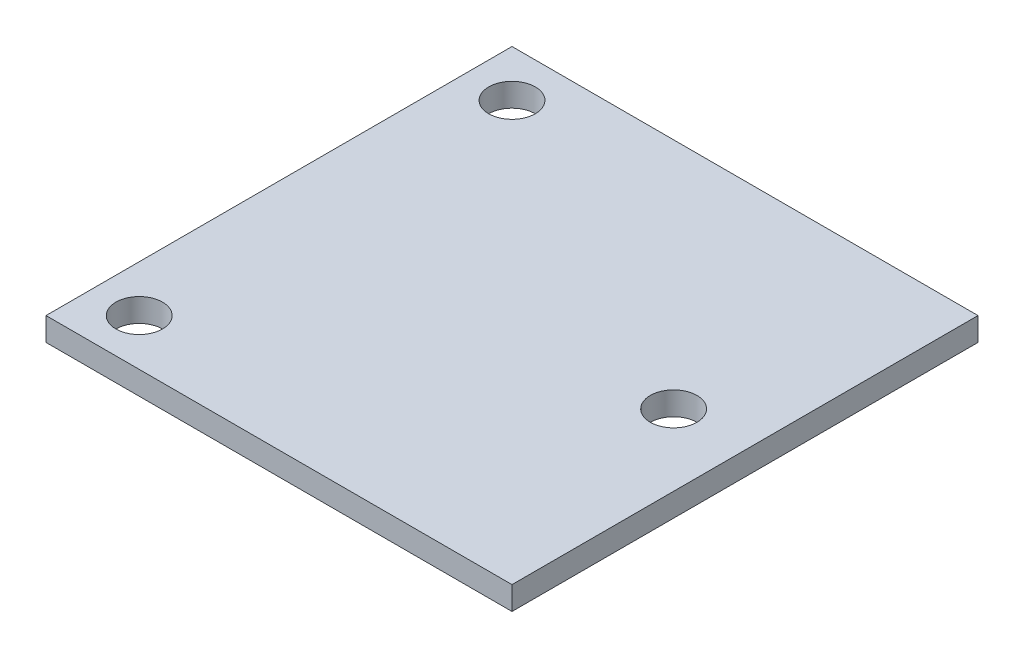
ISO-10303-21;
HEADER;
FILE_DESCRIPTION(('STEP AP214'),'2;1');
FILE_NAME('part.step','',(''),(''),'','','');
FILE_SCHEMA(('AUTOMOTIVE_DESIGN { 1 0 10303 214 1 1 1 1 }'));
ENDSEC;
DATA;
#1=APPLICATION_CONTEXT('core data for automotive mechanical design processes');
#2=APPLICATION_PROTOCOL_DEFINITION('international standard','automotive_design',2000,#1);
#3=PRODUCT_CONTEXT('',#1,'mechanical');
#4=PRODUCT('Part','Part','',(#3));
#5=PRODUCT_RELATED_PRODUCT_CATEGORY('part','',(#4));
#6=PRODUCT_DEFINITION_FORMATION('','',#4);
#7=PRODUCT_DEFINITION_CONTEXT('part definition',#1,'design');
#8=PRODUCT_DEFINITION('design','',#6,#7);
#9=PRODUCT_DEFINITION_SHAPE('','',#8);
#10=(LENGTH_UNIT() NAMED_UNIT(*) SI_UNIT(.MILLI.,.METRE.));
#11=(NAMED_UNIT(*) PLANE_ANGLE_UNIT() SI_UNIT($,.RADIAN.));
#12=(NAMED_UNIT(*) SI_UNIT($,.STERADIAN.) SOLID_ANGLE_UNIT());
#13=UNCERTAINTY_MEASURE_WITH_UNIT(LENGTH_MEASURE(1.E-05),#10,'distance_accuracy_value','');
#14=(GEOMETRIC_REPRESENTATION_CONTEXT(3) GLOBAL_UNCERTAINTY_ASSIGNED_CONTEXT((#13)) GLOBAL_UNIT_ASSIGNED_CONTEXT((#10,
#11,#12)) REPRESENTATION_CONTEXT('',''));
#15=CARTESIAN_POINT('',(0.,0.,0.));
#16=DIRECTION('',(0.,0.,1.));
#17=DIRECTION('',(1.,0.,0.));
#18=AXIS2_PLACEMENT_3D('',#15,#16,#17);
#19=CARTESIAN_POINT('',(0.,6.35,0.));
#20=DIRECTION('',(0.,-1.,0.));
#21=DIRECTION('',(0.,0.,-1.));
#22=AXIS2_PLACEMENT_3D('',#19,#20,#21);
#23=PLANE('',#22);
#24=DIRECTION('',(0.,0.,-1.));
#25=VECTOR('',#24,1.);
#26=CARTESIAN_POINT('',(127.,6.35,63.5));
#27=LINE('',#26,#25);
#28=CARTESIAN_POINT('',(127.,6.35,63.5));
#29=VERTEX_POINT('',#28);
#30=CARTESIAN_POINT('',(127.,6.35,-63.5));
#31=VERTEX_POINT('',#30);
#32=EDGE_CURVE('E87',#29,#31,#27,.T.);
#33=ORIENTED_EDGE('',*,*,#32,.T.);
#34=DIRECTION('',(-1.,0.,0.));
#35=VECTOR('',#34,1.);
#36=CARTESIAN_POINT('',(0.,6.35,-63.5));
#37=LINE('',#36,#35);
#38=CARTESIAN_POINT('',(0.,6.35,-63.5));
#39=VERTEX_POINT('',#38);
#40=EDGE_CURVE('E82',#31,#39,#37,.T.);
#41=ORIENTED_EDGE('',*,*,#40,.T.);
#42=DIRECTION('',(0.,0.,1.));
#43=VECTOR('',#42,1.);
#44=CARTESIAN_POINT('',(0.,6.35,63.5));
#45=LINE('',#44,#43);
#46=CARTESIAN_POINT('',(0.,6.35,63.5));
#47=VERTEX_POINT('',#46);
#48=EDGE_CURVE('E85',#39,#47,#45,.T.);
#49=ORIENTED_EDGE('',*,*,#48,.T.);
#50=DIRECTION('',(1.,0.,0.));
#51=VECTOR('',#50,1.);
#52=CARTESIAN_POINT('',(0.,6.35,63.5));
#53=LINE('',#52,#51);
#54=EDGE_CURVE('E52',#47,#29,#53,.T.);
#55=ORIENTED_EDGE('',*,*,#54,.T.);
#56=EDGE_LOOP('',(#33,#41,#49,#55));
#57=FACE_BOUND('',#56,.T.);
#58=CARTESIAN_POINT('',(12.7,6.35,-50.8));
#59=DIRECTION('',(0.,1.,0.));
#60=DIRECTION('',(0.,0.,1.));
#61=AXIS2_PLACEMENT_3D('',#58,#59,#60);
#62=CIRCLE('',#61,6.35);
#63=CARTESIAN_POINT('',(12.7,6.35,-44.45));
#64=VERTEX_POINT('',#63);
#65=EDGE_CURVE('E102',#64,#64,#62,.T.);
#66=ORIENTED_EDGE('',*,*,#65,.F.);
#67=EDGE_LOOP('',(#66));
#68=FACE_BOUND('',#67,.T.);
#69=CARTESIAN_POINT('',(12.7,6.35,50.8));
#70=DIRECTION('',(0.,1.,0.));
#71=DIRECTION('',(0.,0.,1.));
#72=AXIS2_PLACEMENT_3D('',#69,#70,#71);
#73=CIRCLE('',#72,6.35);
#74=CARTESIAN_POINT('',(12.7,6.35,57.15));
#75=VERTEX_POINT('',#74);
#76=EDGE_CURVE('E117',#75,#75,#73,.T.);
#77=ORIENTED_EDGE('',*,*,#76,.F.);
#78=EDGE_LOOP('',(#77));
#79=FACE_BOUND('',#78,.T.);
#80=CARTESIAN_POINT('',(107.550712,6.35,0.));
#81=DIRECTION('',(0.,1.,0.));
#82=DIRECTION('',(0.,0.,1.));
#83=AXIS2_PLACEMENT_3D('',#80,#81,#82);
#84=CIRCLE('',#83,6.35);
#85=CARTESIAN_POINT('',(107.550712,6.35,6.34999999999999));
#86=VERTEX_POINT('',#85);
#87=EDGE_CURVE('E123',#86,#86,#84,.T.);
#88=ORIENTED_EDGE('',*,*,#87,.F.);
#89=EDGE_LOOP('',(#88));
#90=FACE_BOUND('',#89,.T.);
#91=ADVANCED_FACE('F35',(#57,#68,#79,#90),#23,.F.);
#92=CARTESIAN_POINT('',(0.,0.,0.));
#93=DIRECTION('',(0.,-1.,0.));
#94=DIRECTION('',(0.,0.,-1.));
#95=AXIS2_PLACEMENT_3D('',#92,#93,#94);
#96=PLANE('',#95);
#97=CARTESIAN_POINT('',(12.7,0.,50.8));
#98=DIRECTION('',(0.,1.,0.));
#99=DIRECTION('',(0.,0.,1.));
#100=AXIS2_PLACEMENT_3D('',#97,#98,#99);
#101=CIRCLE('',#100,6.35);
#102=CARTESIAN_POINT('',(12.7,0.,57.15));
#103=VERTEX_POINT('',#102);
#104=EDGE_CURVE('E120',#103,#103,#101,.T.);
#105=ORIENTED_EDGE('',*,*,#104,.T.);
#106=EDGE_LOOP('',(#105));
#107=FACE_BOUND('',#106,.T.);
#108=DIRECTION('',(0.,0.,-1.));
#109=VECTOR('',#108,1.);
#110=CARTESIAN_POINT('',(127.,0.,63.5));
#111=LINE('',#110,#109);
#112=CARTESIAN_POINT('',(127.,0.,63.5));
#113=VERTEX_POINT('',#112);
#114=CARTESIAN_POINT('',(127.,0.,-63.5));
#115=VERTEX_POINT('',#114);
#116=EDGE_CURVE('E99',#113,#115,#111,.T.);
#117=ORIENTED_EDGE('',*,*,#116,.F.);
#118=DIRECTION('',(1.,0.,0.));
#119=VECTOR('',#118,1.);
#120=CARTESIAN_POINT('',(0.,0.,63.5));
#121=LINE('',#120,#119);
#122=CARTESIAN_POINT('',(0.,0.,63.5));
#123=VERTEX_POINT('',#122);
#124=EDGE_CURVE('E75',#123,#113,#121,.T.);
#125=ORIENTED_EDGE('',*,*,#124,.F.);
#126=DIRECTION('',(0.,0.,1.));
#127=VECTOR('',#126,1.);
#128=CARTESIAN_POINT('',(0.,0.,63.5));
#129=LINE('',#128,#127);
#130=CARTESIAN_POINT('',(0.,0.,-63.5));
#131=VERTEX_POINT('',#130);
#132=EDGE_CURVE('E69',#131,#123,#129,.T.);
#133=ORIENTED_EDGE('',*,*,#132,.F.);
#134=DIRECTION('',(-1.,0.,0.));
#135=VECTOR('',#134,1.);
#136=CARTESIAN_POINT('',(0.,0.,-63.5));
#137=LINE('',#136,#135);
#138=EDGE_CURVE('E91',#115,#131,#137,.T.);
#139=ORIENTED_EDGE('',*,*,#138,.F.);
#140=EDGE_LOOP('',(#117,#125,#133,#139));
#141=FACE_BOUND('',#140,.T.);
#142=CARTESIAN_POINT('',(12.7,0.,-50.8));
#143=DIRECTION('',(0.,1.,0.));
#144=DIRECTION('',(0.,0.,1.));
#145=AXIS2_PLACEMENT_3D('',#142,#143,#144);
#146=CIRCLE('',#145,6.35);
#147=CARTESIAN_POINT('',(12.7,0.,-44.45));
#148=VERTEX_POINT('',#147);
#149=EDGE_CURVE('E114',#148,#148,#146,.T.);
#150=ORIENTED_EDGE('',*,*,#149,.T.);
#151=EDGE_LOOP('',(#150));
#152=FACE_BOUND('',#151,.T.);
#153=CARTESIAN_POINT('',(107.550712,0.,0.));
#154=DIRECTION('',(0.,1.,0.));
#155=DIRECTION('',(0.,0.,1.));
#156=AXIS2_PLACEMENT_3D('',#153,#154,#155);
#157=CIRCLE('',#156,6.35);
#158=CARTESIAN_POINT('',(107.550712,0.,6.34999999999999));
#159=VERTEX_POINT('',#158);
#160=EDGE_CURVE('E126',#159,#159,#157,.T.);
#161=ORIENTED_EDGE('',*,*,#160,.T.);
#162=EDGE_LOOP('',(#161));
#163=FACE_BOUND('',#162,.T.);
#164=ADVANCED_FACE('F110',(#107,#141,#152,#163),#96,.T.);
#165=CARTESIAN_POINT('',(127.,6.35,63.5));
#166=DIRECTION('',(-1.,0.,0.));
#167=DIRECTION('',(0.,0.,1.));
#168=AXIS2_PLACEMENT_3D('',#165,#166,#167);
#169=PLANE('',#168);
#170=ORIENTED_EDGE('',*,*,#116,.T.);
#171=DIRECTION('',(0.,-1.,0.));
#172=VECTOR('',#171,1.);
#173=CARTESIAN_POINT('',(127.,6.35,-63.5));
#174=LINE('',#173,#172);
#175=EDGE_CURVE('E11',#31,#115,#174,.T.);
#176=ORIENTED_EDGE('',*,*,#175,.F.);
#177=ORIENTED_EDGE('',*,*,#32,.F.);
#178=DIRECTION('',(0.,-1.,0.));
#179=VECTOR('',#178,1.);
#180=CARTESIAN_POINT('',(127.,6.35,63.5));
#181=LINE('',#180,#179);
#182=EDGE_CURVE('E95',#29,#113,#181,.T.);
#183=ORIENTED_EDGE('',*,*,#182,.T.);
#184=EDGE_LOOP('',(#170,#176,#177,#183));
#185=FACE_BOUND('',#184,.T.);
#186=ADVANCED_FACE('F37',(#185),#169,.F.);
#187=CARTESIAN_POINT('',(0.,6.35,-63.5));
#188=DIRECTION('',(0.,0.,1.));
#189=DIRECTION('',(1.,0.,0.));
#190=AXIS2_PLACEMENT_3D('',#187,#188,#189);
#191=PLANE('',#190);
#192=ORIENTED_EDGE('',*,*,#138,.T.);
#193=DIRECTION('',(0.,-1.,0.));
#194=VECTOR('',#193,1.);
#195=CARTESIAN_POINT('',(0.,6.35,-63.5));
#196=LINE('',#195,#194);
#197=EDGE_CURVE('E44',#39,#131,#196,.T.);
#198=ORIENTED_EDGE('',*,*,#197,.F.);
#199=ORIENTED_EDGE('',*,*,#40,.F.);
#200=ORIENTED_EDGE('',*,*,#175,.T.);
#201=EDGE_LOOP('',(#192,#198,#199,#200));
#202=FACE_BOUND('',#201,.T.);
#203=ADVANCED_FACE('F90',(#202),#191,.F.);
#204=CARTESIAN_POINT('',(0.,6.35,63.5));
#205=DIRECTION('',(1.,0.,0.));
#206=DIRECTION('',(0.,0.,-1.));
#207=AXIS2_PLACEMENT_3D('',#204,#205,#206);
#208=PLANE('',#207);
#209=ORIENTED_EDGE('',*,*,#132,.T.);
#210=DIRECTION('',(0.,-1.,0.));
#211=VECTOR('',#210,1.);
#212=CARTESIAN_POINT('',(0.,6.35,63.5));
#213=LINE('',#212,#211);
#214=EDGE_CURVE('E92',#47,#123,#213,.T.);
#215=ORIENTED_EDGE('',*,*,#214,.F.);
#216=ORIENTED_EDGE('',*,*,#48,.F.);
#217=ORIENTED_EDGE('',*,*,#197,.T.);
#218=EDGE_LOOP('',(#209,#215,#216,#217));
#219=FACE_BOUND('',#218,.T.);
#220=ADVANCED_FACE('F93',(#219),#208,.F.);
#221=CARTESIAN_POINT('',(0.,6.35,63.5));
#222=DIRECTION('',(0.,0.,-1.));
#223=DIRECTION('',(-1.,0.,0.));
#224=AXIS2_PLACEMENT_3D('',#221,#222,#223);
#225=PLANE('',#224);
#226=ORIENTED_EDGE('',*,*,#124,.T.);
#227=ORIENTED_EDGE('',*,*,#182,.F.);
#228=ORIENTED_EDGE('',*,*,#54,.F.);
#229=ORIENTED_EDGE('',*,*,#214,.T.);
#230=EDGE_LOOP('',(#226,#227,#228,#229));
#231=FACE_BOUND('',#230,.T.);
#232=ADVANCED_FACE('F107',(#231),#225,.F.);
#233=CARTESIAN_POINT('',(12.7,6.35,-50.8));
#234=DIRECTION('',(0.,-1.,0.));
#235=DIRECTION('',(0.,0.,-1.));
#236=AXIS2_PLACEMENT_3D('',#233,#234,#235);
#237=CYLINDRICAL_SURFACE('',#236,6.35);
#238=ORIENTED_EDGE('',*,*,#65,.T.);
#239=EDGE_LOOP('',(#238));
#240=FACE_BOUND('',#239,.T.);
#241=ORIENTED_EDGE('',*,*,#149,.F.);
#242=EDGE_LOOP('',(#241));
#243=FACE_BOUND('',#242,.T.);
#244=ADVANCED_FACE('F143',(#240,#243),#237,.F.);
#245=CARTESIAN_POINT('',(12.7,6.35,50.8));
#246=DIRECTION('',(0.,-1.,0.));
#247=DIRECTION('',(0.,0.,-1.));
#248=AXIS2_PLACEMENT_3D('',#245,#246,#247);
#249=CYLINDRICAL_SURFACE('',#248,6.35);
#250=ORIENTED_EDGE('',*,*,#76,.T.);
#251=EDGE_LOOP('',(#250));
#252=FACE_BOUND('',#251,.T.);
#253=ORIENTED_EDGE('',*,*,#104,.F.);
#254=EDGE_LOOP('',(#253));
#255=FACE_BOUND('',#254,.T.);
#256=ADVANCED_FACE('F189',(#252,#255),#249,.F.);
#257=CARTESIAN_POINT('',(107.550712,6.35,0.));
#258=DIRECTION('',(0.,-1.,0.));
#259=DIRECTION('',(0.,0.,-1.));
#260=AXIS2_PLACEMENT_3D('',#257,#258,#259);
#261=CYLINDRICAL_SURFACE('',#260,6.35);
#262=ORIENTED_EDGE('',*,*,#87,.T.);
#263=EDGE_LOOP('',(#262));
#264=FACE_BOUND('',#263,.T.);
#265=ORIENTED_EDGE('',*,*,#160,.F.);
#266=EDGE_LOOP('',(#265));
#267=FACE_BOUND('',#266,.T.);
#268=ADVANCED_FACE('F132',(#264,#267),#261,.F.);
#269=CLOSED_SHELL('',(#91,#164,#186,#203,#220,#232,#244,#256,#268));
#270=MANIFOLD_SOLID_BREP('B2',#269);
#271=ADVANCED_BREP_SHAPE_REPRESENTATION('',(#18,#270),#14);
#272=SHAPE_DEFINITION_REPRESENTATION(#9,#271);
ENDSEC;
END-ISO-10303-21;
